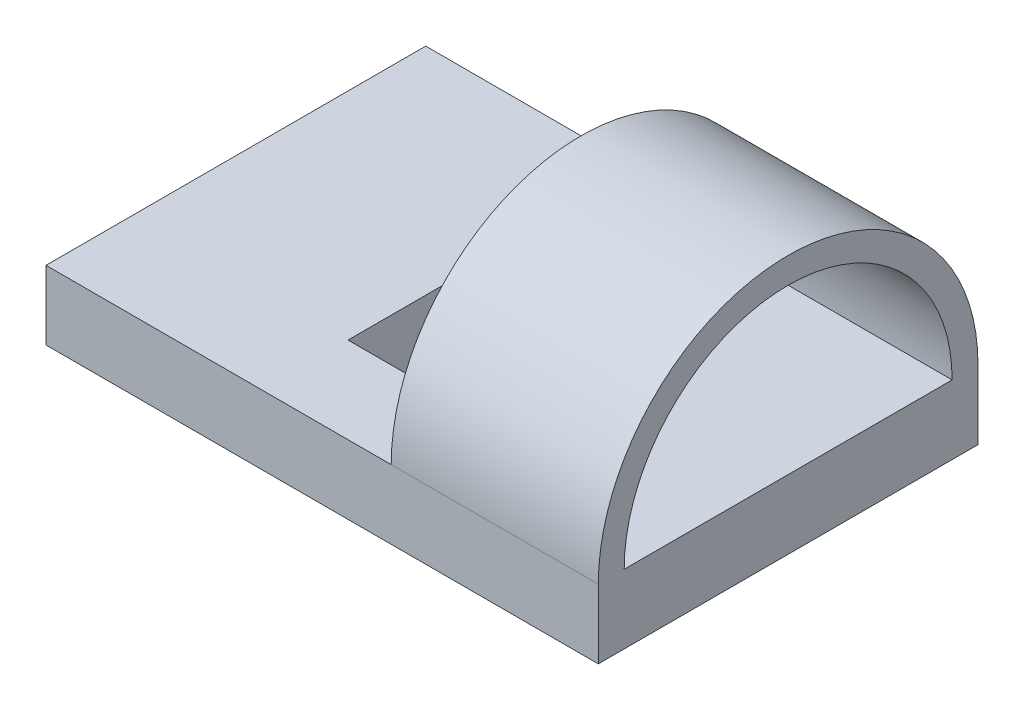
ISO-10303-21;
HEADER;
FILE_DESCRIPTION(('STEP AP214'),'2;1');
FILE_NAME('part.step','',(''),(''),'','','');
FILE_SCHEMA(('AUTOMOTIVE_DESIGN { 1 0 10303 214 1 1 1 1 }'));
ENDSEC;
DATA;
#1=APPLICATION_CONTEXT('core data for automotive mechanical design processes');
#2=APPLICATION_PROTOCOL_DEFINITION('international standard','automotive_design',2000,#1);
#3=PRODUCT_CONTEXT('',#1,'mechanical');
#4=PRODUCT('Part','Part','',(#3));
#5=PRODUCT_RELATED_PRODUCT_CATEGORY('part','',(#4));
#6=PRODUCT_DEFINITION_FORMATION('','',#4);
#7=PRODUCT_DEFINITION_CONTEXT('part definition',#1,'design');
#8=PRODUCT_DEFINITION('design','',#6,#7);
#9=PRODUCT_DEFINITION_SHAPE('','',#8);
#10=(LENGTH_UNIT() NAMED_UNIT(*) SI_UNIT(.MILLI.,.METRE.));
#11=(NAMED_UNIT(*) PLANE_ANGLE_UNIT() SI_UNIT($,.RADIAN.));
#12=(NAMED_UNIT(*) SI_UNIT($,.STERADIAN.) SOLID_ANGLE_UNIT());
#13=UNCERTAINTY_MEASURE_WITH_UNIT(LENGTH_MEASURE(1.E-05),#10,'distance_accuracy_value','');
#14=(GEOMETRIC_REPRESENTATION_CONTEXT(3) GLOBAL_UNCERTAINTY_ASSIGNED_CONTEXT((#13)) GLOBAL_UNIT_ASSIGNED_CONTEXT((#10,
#11,#12)) REPRESENTATION_CONTEXT('',''));
#15=CARTESIAN_POINT('',(0.,0.,0.));
#16=DIRECTION('',(0.,0.,1.));
#17=DIRECTION('',(1.,0.,0.));
#18=AXIS2_PLACEMENT_3D('',#15,#16,#17);
#19=CARTESIAN_POINT('',(0.,2.,0.));
#20=DIRECTION('',(0.,-1.,0.));
#21=DIRECTION('',(0.,0.,-1.));
#22=AXIS2_PLACEMENT_3D('',#19,#20,#21);
#23=PLANE('',#22);
#24=DIRECTION('',(0.,0.,-1.));
#25=VECTOR('',#24,1.);
#26=CARTESIAN_POINT('',(-1.75,2.,0.));
#27=LINE('',#26,#25);
#28=CARTESIAN_POINT('',(-1.75,2.,3.));
#29=VERTEX_POINT('',#28);
#30=CARTESIAN_POINT('',(-1.75,2.,-3.));
#31=VERTEX_POINT('',#30);
#32=EDGE_CURVE('E149',#29,#31,#27,.T.);
#33=ORIENTED_EDGE('',*,*,#32,.T.);
#34=DIRECTION('',(1.,0.,0.));
#35=VECTOR('',#34,1.);
#36=CARTESIAN_POINT('',(0.,2.,-3.));
#37=LINE('',#36,#35);
#38=CARTESIAN_POINT('',(1.75,2.,-3.));
#39=VERTEX_POINT('',#38);
#40=EDGE_CURVE('E152',#31,#39,#37,.T.);
#41=ORIENTED_EDGE('',*,*,#40,.T.);
#42=DIRECTION('',(0.,0.,1.));
#43=VECTOR('',#42,1.);
#44=CARTESIAN_POINT('',(1.75,2.,0.));
#45=LINE('',#44,#43);
#46=CARTESIAN_POINT('',(1.75,2.,3.));
#47=VERTEX_POINT('',#46);
#48=EDGE_CURVE('E144',#39,#47,#45,.T.);
#49=ORIENTED_EDGE('',*,*,#48,.T.);
#50=DIRECTION('',(-1.,0.,0.));
#51=VECTOR('',#50,1.);
#52=CARTESIAN_POINT('',(0.,2.,3.));
#53=LINE('',#52,#51);
#54=EDGE_CURVE('E124',#47,#29,#53,.T.);
#55=ORIENTED_EDGE('',*,*,#54,.T.);
#56=EDGE_LOOP('',(#33,#41,#49,#55));
#57=FACE_BOUND('',#56,.T.);
#58=DIRECTION('',(-1.,0.,0.));
#59=VECTOR('',#58,1.);
#60=CARTESIAN_POINT('',(8.,2.,-4.75));
#61=LINE('',#60,#59);
#62=CARTESIAN_POINT('',(8.,2.,-4.75));
#63=VERTEX_POINT('',#62);
#64=CARTESIAN_POINT('',(2.,2.,-4.75));
#65=VERTEX_POINT('',#64);
#66=EDGE_CURVE('E177',#63,#65,#61,.T.);
#67=ORIENTED_EDGE('',*,*,#66,.T.);
#68=DIRECTION('',(0.,0.,-1.));
#69=VECTOR('',#68,1.);
#70=CARTESIAN_POINT('',(2.,2.,-4.75));
#71=LINE('',#70,#69);
#72=CARTESIAN_POINT('',(2.,2.,-5.5));
#73=VERTEX_POINT('',#72);
#74=EDGE_CURVE('E166',#65,#73,#71,.T.);
#75=ORIENTED_EDGE('',*,*,#74,.T.);
#76=DIRECTION('',(-1.,0.,0.));
#77=VECTOR('',#76,1.);
#78=CARTESIAN_POINT('',(-8.,2.,-5.5));
#79=LINE('',#78,#77);
#80=CARTESIAN_POINT('',(-8.,2.,-5.5));
#81=VERTEX_POINT('',#80);
#82=EDGE_CURVE('E182',#73,#81,#79,.T.);
#83=ORIENTED_EDGE('',*,*,#82,.T.);
#84=DIRECTION('',(0.,0.,1.));
#85=VECTOR('',#84,1.);
#86=CARTESIAN_POINT('',(-8.,2.,5.5));
#87=LINE('',#86,#85);
#88=CARTESIAN_POINT('',(-8.,2.,5.5));
#89=VERTEX_POINT('',#88);
#90=EDGE_CURVE('E187',#81,#89,#87,.T.);
#91=ORIENTED_EDGE('',*,*,#90,.T.);
#92=DIRECTION('',(1.,0.,0.));
#93=VECTOR('',#92,1.);
#94=CARTESIAN_POINT('',(-8.,2.,5.5));
#95=LINE('',#94,#93);
#96=CARTESIAN_POINT('',(2.,2.,5.5));
#97=VERTEX_POINT('',#96);
#98=EDGE_CURVE('E189',#89,#97,#95,.T.);
#99=ORIENTED_EDGE('',*,*,#98,.T.);
#100=DIRECTION('',(0.,0.,-1.));
#101=VECTOR('',#100,1.);
#102=CARTESIAN_POINT('',(2.,2.,5.5));
#103=LINE('',#102,#101);
#104=CARTESIAN_POINT('',(2.,2.,4.75));
#105=VERTEX_POINT('',#104);
#106=EDGE_CURVE('E160',#97,#105,#103,.T.);
#107=ORIENTED_EDGE('',*,*,#106,.T.);
#108=DIRECTION('',(-1.,0.,0.));
#109=VECTOR('',#108,1.);
#110=CARTESIAN_POINT('',(8.,2.,4.75));
#111=LINE('',#110,#109);
#112=CARTESIAN_POINT('',(8.,2.,4.75));
#113=VERTEX_POINT('',#112);
#114=EDGE_CURVE('E163',#113,#105,#111,.T.);
#115=ORIENTED_EDGE('',*,*,#114,.F.);
#116=DIRECTION('',(0.,0.,-1.));
#117=VECTOR('',#116,1.);
#118=CARTESIAN_POINT('',(8.,2.,5.5));
#119=LINE('',#118,#117);
#120=EDGE_CURVE('E180',#113,#63,#119,.T.);
#121=ORIENTED_EDGE('',*,*,#120,.T.);
#122=EDGE_LOOP('',(#67,#75,#83,#91,#99,#107,#115,#121));
#123=FACE_BOUND('',#122,.T.);
#124=ADVANCED_FACE('F35',(#57,#123),#23,.F.);
#125=CARTESIAN_POINT('',(8.,2.,5.5));
#126=DIRECTION('',(-1.,0.,0.));
#127=DIRECTION('',(0.,0.,1.));
#128=AXIS2_PLACEMENT_3D('',#125,#126,#127);
#129=PLANE('',#128);
#130=DIRECTION('',(0.,-1.,0.));
#131=VECTOR('',#130,1.);
#132=CARTESIAN_POINT('',(8.,2.,-5.5));
#133=LINE('',#132,#131);
#134=CARTESIAN_POINT('',(8.,2.,-5.5));
#135=VERTEX_POINT('',#134);
#136=CARTESIAN_POINT('',(8.,0.,-5.5));
#137=VERTEX_POINT('',#136);
#138=EDGE_CURVE('E11',#135,#137,#133,.T.);
#139=ORIENTED_EDGE('',*,*,#138,.F.);
#140=CARTESIAN_POINT('',(8.,2.,0.));
#141=DIRECTION('',(1.,0.,0.));
#142=DIRECTION('',(0.,0.,-1.));
#143=AXIS2_PLACEMENT_3D('',#140,#141,#142);
#144=CIRCLE('',#143,5.5);
#145=CARTESIAN_POINT('',(8.,2.,5.5));
#146=VERTEX_POINT('',#145);
#147=EDGE_CURVE('E159',#135,#146,#144,.T.);
#148=ORIENTED_EDGE('',*,*,#147,.T.);
#149=DIRECTION('',(0.,-1.,0.));
#150=VECTOR('',#149,1.);
#151=CARTESIAN_POINT('',(8.,2.,5.5));
#152=LINE('',#151,#150);
#153=CARTESIAN_POINT('',(8.,0.,5.5));
#154=VERTEX_POINT('',#153);
#155=EDGE_CURVE('E191',#146,#154,#152,.T.);
#156=ORIENTED_EDGE('',*,*,#155,.T.);
#157=DIRECTION('',(0.,0.,-1.));
#158=VECTOR('',#157,1.);
#159=CARTESIAN_POINT('',(8.,0.,5.5));
#160=LINE('',#159,#158);
#161=EDGE_CURVE('E179',#154,#137,#160,.T.);
#162=ORIENTED_EDGE('',*,*,#161,.T.);
#163=EDGE_LOOP('',(#139,#148,#156,#162));
#164=FACE_BOUND('',#163,.T.);
#165=CARTESIAN_POINT('',(8.,2.,0.));
#166=DIRECTION('',(-1.,0.,0.));
#167=DIRECTION('',(0.,0.,-1.));
#168=AXIS2_PLACEMENT_3D('',#165,#166,#167);
#169=CIRCLE('',#168,4.75);
#170=EDGE_CURVE('E156',#113,#63,#169,.T.);
#171=ORIENTED_EDGE('',*,*,#170,.T.);
#172=ORIENTED_EDGE('',*,*,#120,.F.);
#173=EDGE_LOOP('',(#171,#172));
#174=FACE_BOUND('',#173,.T.);
#175=ADVANCED_FACE('F37',(#164,#174),#129,.F.);
#176=CARTESIAN_POINT('',(-8.,2.,-5.5));
#177=DIRECTION('',(0.,0.,1.));
#178=DIRECTION('',(1.,0.,0.));
#179=AXIS2_PLACEMENT_3D('',#176,#177,#178);
#180=PLANE('',#179);
#181=DIRECTION('',(-1.,0.,0.));
#182=VECTOR('',#181,1.);
#183=CARTESIAN_POINT('',(-8.,0.,-5.5));
#184=LINE('',#183,#182);
#185=CARTESIAN_POINT('',(-8.,0.,-5.5));
#186=VERTEX_POINT('',#185);
#187=EDGE_CURVE('E194',#137,#186,#184,.T.);
#188=ORIENTED_EDGE('',*,*,#187,.T.);
#189=DIRECTION('',(0.,-1.,0.));
#190=VECTOR('',#189,1.);
#191=CARTESIAN_POINT('',(-8.,2.,-5.5));
#192=LINE('',#191,#190);
#193=EDGE_CURVE('E43',#81,#186,#192,.T.);
#194=ORIENTED_EDGE('',*,*,#193,.F.);
#195=ORIENTED_EDGE('',*,*,#82,.F.);
#196=EDGE_CURVE('E184',#135,#73,#79,.T.);
#197=ORIENTED_EDGE('',*,*,#196,.F.);
#198=ORIENTED_EDGE('',*,*,#138,.T.);
#199=EDGE_LOOP('',(#188,#194,#195,#197,#198));
#200=FACE_BOUND('',#199,.T.);
#201=ADVANCED_FACE('F228',(#200),#180,.F.);
#202=CARTESIAN_POINT('',(-8.,2.,5.5));
#203=DIRECTION('',(1.,0.,0.));
#204=DIRECTION('',(0.,0.,-1.));
#205=AXIS2_PLACEMENT_3D('',#202,#203,#204);
#206=PLANE('',#205);
#207=DIRECTION('',(0.,0.,1.));
#208=VECTOR('',#207,1.);
#209=CARTESIAN_POINT('',(-8.,0.,5.5));
#210=LINE('',#209,#208);
#211=CARTESIAN_POINT('',(-8.,0.,5.5));
#212=VERTEX_POINT('',#211);
#213=EDGE_CURVE('E196',#186,#212,#210,.T.);
#214=ORIENTED_EDGE('',*,*,#213,.T.);
#215=DIRECTION('',(0.,-1.,0.));
#216=VECTOR('',#215,1.);
#217=CARTESIAN_POINT('',(-8.,2.,5.5));
#218=LINE('',#217,#216);
#219=EDGE_CURVE('E201',#89,#212,#218,.T.);
#220=ORIENTED_EDGE('',*,*,#219,.F.);
#221=ORIENTED_EDGE('',*,*,#90,.F.);
#222=ORIENTED_EDGE('',*,*,#193,.T.);
#223=EDGE_LOOP('',(#214,#220,#221,#222));
#224=FACE_BOUND('',#223,.T.);
#225=ADVANCED_FACE('F208',(#224),#206,.F.);
#226=CARTESIAN_POINT('',(-8.,2.,5.5));
#227=DIRECTION('',(0.,0.,-1.));
#228=DIRECTION('',(-1.,0.,0.));
#229=AXIS2_PLACEMENT_3D('',#226,#227,#228);
#230=PLANE('',#229);
#231=DIRECTION('',(1.,0.,0.));
#232=VECTOR('',#231,1.);
#233=CARTESIAN_POINT('',(-8.,0.,5.5));
#234=LINE('',#233,#232);
#235=EDGE_CURVE('E183',#212,#154,#234,.T.);
#236=ORIENTED_EDGE('',*,*,#235,.T.);
#237=ORIENTED_EDGE('',*,*,#155,.F.);
#238=DIRECTION('',(-1.,0.,0.));
#239=VECTOR('',#238,1.);
#240=CARTESIAN_POINT('',(8.,2.,5.5));
#241=LINE('',#240,#239);
#242=EDGE_CURVE('E174',#146,#97,#241,.T.);
#243=ORIENTED_EDGE('',*,*,#242,.T.);
#244=ORIENTED_EDGE('',*,*,#98,.F.);
#245=ORIENTED_EDGE('',*,*,#219,.T.);
#246=EDGE_LOOP('',(#236,#237,#243,#244,#245));
#247=FACE_BOUND('',#246,.T.);
#248=ADVANCED_FACE('F215',(#247),#230,.F.);
#249=CARTESIAN_POINT('',(0.,0.,0.));
#250=DIRECTION('',(0.,-1.,0.));
#251=DIRECTION('',(0.,0.,-1.));
#252=AXIS2_PLACEMENT_3D('',#249,#250,#251);
#253=PLANE('',#252);
#254=DIRECTION('',(1.,0.,0.));
#255=VECTOR('',#254,1.);
#256=CARTESIAN_POINT('',(1.75,0.,-3.));
#257=LINE('',#256,#255);
#258=CARTESIAN_POINT('',(-1.75,0.,-3.));
#259=VERTEX_POINT('',#258);
#260=CARTESIAN_POINT('',(1.75,0.,-3.));
#261=VERTEX_POINT('',#260);
#262=EDGE_CURVE('E58',#259,#261,#257,.T.);
#263=ORIENTED_EDGE('',*,*,#262,.F.);
#264=DIRECTION('',(0.,0.,-1.));
#265=VECTOR('',#264,1.);
#266=CARTESIAN_POINT('',(-1.75,0.,3.));
#267=LINE('',#266,#265);
#268=CARTESIAN_POINT('',(-1.75,0.,3.));
#269=VERTEX_POINT('',#268);
#270=EDGE_CURVE('E137',#269,#259,#267,.T.);
#271=ORIENTED_EDGE('',*,*,#270,.F.);
#272=DIRECTION('',(-1.,0.,0.));
#273=VECTOR('',#272,1.);
#274=CARTESIAN_POINT('',(1.75,0.,3.));
#275=LINE('',#274,#273);
#276=CARTESIAN_POINT('',(1.75,0.,3.));
#277=VERTEX_POINT('',#276);
#278=EDGE_CURVE('E121',#277,#269,#275,.T.);
#279=ORIENTED_EDGE('',*,*,#278,.F.);
#280=DIRECTION('',(0.,0.,1.));
#281=VECTOR('',#280,1.);
#282=CARTESIAN_POINT('',(1.75,0.,3.));
#283=LINE('',#282,#281);
#284=EDGE_CURVE('E130',#261,#277,#283,.T.);
#285=ORIENTED_EDGE('',*,*,#284,.F.);
#286=EDGE_LOOP('',(#263,#271,#279,#285));
#287=FACE_BOUND('',#286,.T.);
#288=ORIENTED_EDGE('',*,*,#161,.F.);
#289=ORIENTED_EDGE('',*,*,#235,.F.);
#290=ORIENTED_EDGE('',*,*,#213,.F.);
#291=ORIENTED_EDGE('',*,*,#187,.F.);
#292=EDGE_LOOP('',(#288,#289,#290,#291));
#293=FACE_BOUND('',#292,.T.);
#294=ADVANCED_FACE('F134',(#287,#293),#253,.T.);
#295=CARTESIAN_POINT('',(8.,2.,0.));
#296=DIRECTION('',(-1.,0.,0.));
#297=DIRECTION('',(0.,0.,1.));
#298=AXIS2_PLACEMENT_3D('',#295,#296,#297);
#299=CYLINDRICAL_SURFACE('',#298,4.75);
#300=CARTESIAN_POINT('',(2.,2.,0.));
#301=DIRECTION('',(-1.,0.,0.));
#302=DIRECTION('',(0.,0.,-1.));
#303=AXIS2_PLACEMENT_3D('',#300,#301,#302);
#304=CIRCLE('',#303,4.75);
#305=EDGE_CURVE('E155',#105,#65,#304,.T.);
#306=ORIENTED_EDGE('',*,*,#305,.T.);
#307=ORIENTED_EDGE('',*,*,#66,.F.);
#308=ORIENTED_EDGE('',*,*,#170,.F.);
#309=ORIENTED_EDGE('',*,*,#114,.T.);
#310=EDGE_LOOP('',(#306,#307,#308,#309));
#311=FACE_BOUND('',#310,.T.);
#312=ADVANCED_FACE('F234',(#311),#299,.F.);
#313=CARTESIAN_POINT('',(8.,2.,0.));
#314=DIRECTION('',(-1.,0.,0.));
#315=DIRECTION('',(0.,0.,1.));
#316=AXIS2_PLACEMENT_3D('',#313,#314,#315);
#317=CYLINDRICAL_SURFACE('',#316,5.5);
#318=CARTESIAN_POINT('',(2.,2.,0.));
#319=DIRECTION('',(1.,0.,0.));
#320=DIRECTION('',(0.,0.,-1.));
#321=AXIS2_PLACEMENT_3D('',#318,#319,#320);
#322=CIRCLE('',#321,5.5);
#323=EDGE_CURVE('E168',#73,#97,#322,.T.);
#324=ORIENTED_EDGE('',*,*,#323,.T.);
#325=ORIENTED_EDGE('',*,*,#242,.F.);
#326=ORIENTED_EDGE('',*,*,#147,.F.);
#327=ORIENTED_EDGE('',*,*,#196,.T.);
#328=EDGE_LOOP('',(#324,#325,#326,#327));
#329=FACE_BOUND('',#328,.T.);
#330=ADVANCED_FACE('F223',(#329),#317,.T.);
#331=CARTESIAN_POINT('',(2.,2.,0.));
#332=DIRECTION('',(1.,0.,0.));
#333=DIRECTION('',(0.,0.,-1.));
#334=AXIS2_PLACEMENT_3D('',#331,#332,#333);
#335=PLANE('',#334);
#336=ORIENTED_EDGE('',*,*,#305,.F.);
#337=ORIENTED_EDGE('',*,*,#106,.F.);
#338=ORIENTED_EDGE('',*,*,#323,.F.);
#339=ORIENTED_EDGE('',*,*,#74,.F.);
#340=EDGE_LOOP('',(#336,#337,#338,#339));
#341=FACE_BOUND('',#340,.T.);
#342=ADVANCED_FACE('F231',(#341),#335,.F.);
#343=CARTESIAN_POINT('',(1.75,7.5,-3.));
#344=DIRECTION('',(0.,0.,-1.));
#345=DIRECTION('',(-1.,0.,0.));
#346=AXIS2_PLACEMENT_3D('',#343,#344,#345);
#347=PLANE('',#346);
#348=DIRECTION('',(0.,-1.,0.));
#349=VECTOR('',#348,1.);
#350=CARTESIAN_POINT('',(-1.75,7.5,-3.));
#351=LINE('',#350,#349);
#352=EDGE_CURVE('E142',#31,#259,#351,.T.);
#353=ORIENTED_EDGE('',*,*,#352,.T.);
#354=ORIENTED_EDGE('',*,*,#262,.T.);
#355=DIRECTION('',(0.,-1.,0.));
#356=VECTOR('',#355,1.);
#357=CARTESIAN_POINT('',(1.75,7.5,-3.));
#358=LINE('',#357,#356);
#359=EDGE_CURVE('E127',#39,#261,#358,.T.);
#360=ORIENTED_EDGE('',*,*,#359,.F.);
#361=ORIENTED_EDGE('',*,*,#40,.F.);
#362=EDGE_LOOP('',(#353,#354,#360,#361));
#363=FACE_BOUND('',#362,.T.);
#364=ADVANCED_FACE('F283',(#363),#347,.F.);
#365=CARTESIAN_POINT('',(-1.75,7.5,3.));
#366=DIRECTION('',(-1.,0.,0.));
#367=DIRECTION('',(0.,0.,1.));
#368=AXIS2_PLACEMENT_3D('',#365,#366,#367);
#369=PLANE('',#368);
#370=DIRECTION('',(0.,-1.,0.));
#371=VECTOR('',#370,1.);
#372=CARTESIAN_POINT('',(-1.75,7.5,3.));
#373=LINE('',#372,#371);
#374=EDGE_CURVE('E126',#29,#269,#373,.T.);
#375=ORIENTED_EDGE('',*,*,#374,.T.);
#376=ORIENTED_EDGE('',*,*,#270,.T.);
#377=ORIENTED_EDGE('',*,*,#352,.F.);
#378=ORIENTED_EDGE('',*,*,#32,.F.);
#379=EDGE_LOOP('',(#375,#376,#377,#378));
#380=FACE_BOUND('',#379,.T.);
#381=ADVANCED_FACE('F289',(#380),#369,.F.);
#382=CARTESIAN_POINT('',(1.75,7.5,3.));
#383=DIRECTION('',(0.,0.,1.));
#384=DIRECTION('',(1.,0.,0.));
#385=AXIS2_PLACEMENT_3D('',#382,#383,#384);
#386=PLANE('',#385);
#387=DIRECTION('',(0.,-1.,0.));
#388=VECTOR('',#387,1.);
#389=CARTESIAN_POINT('',(1.75,7.5,3.));
#390=LINE('',#389,#388);
#391=EDGE_CURVE('E50',#47,#277,#390,.T.);
#392=ORIENTED_EDGE('',*,*,#391,.T.);
#393=ORIENTED_EDGE('',*,*,#278,.T.);
#394=ORIENTED_EDGE('',*,*,#374,.F.);
#395=ORIENTED_EDGE('',*,*,#54,.F.);
#396=EDGE_LOOP('',(#392,#393,#394,#395));
#397=FACE_BOUND('',#396,.T.);
#398=ADVANCED_FACE('F118',(#397),#386,.F.);
#399=CARTESIAN_POINT('',(1.75,7.5,3.));
#400=DIRECTION('',(1.,0.,0.));
#401=DIRECTION('',(0.,0.,-1.));
#402=AXIS2_PLACEMENT_3D('',#399,#400,#401);
#403=PLANE('',#402);
#404=ORIENTED_EDGE('',*,*,#359,.T.);
#405=ORIENTED_EDGE('',*,*,#284,.T.);
#406=ORIENTED_EDGE('',*,*,#391,.F.);
#407=ORIENTED_EDGE('',*,*,#48,.F.);
#408=EDGE_LOOP('',(#404,#405,#406,#407));
#409=FACE_BOUND('',#408,.T.);
#410=ADVANCED_FACE('F131',(#409),#403,.F.);
#411=CLOSED_SHELL('',(#124,#175,#201,#225,#248,#294,#312,#330,#342,#364,#381,#398,#410));
#412=MANIFOLD_SOLID_BREP('B2',#411);
#413=ADVANCED_BREP_SHAPE_REPRESENTATION('',(#18,#412),#14);
#414=SHAPE_DEFINITION_REPRESENTATION(#9,#413);
ENDSEC;
END-ISO-10303-21;
